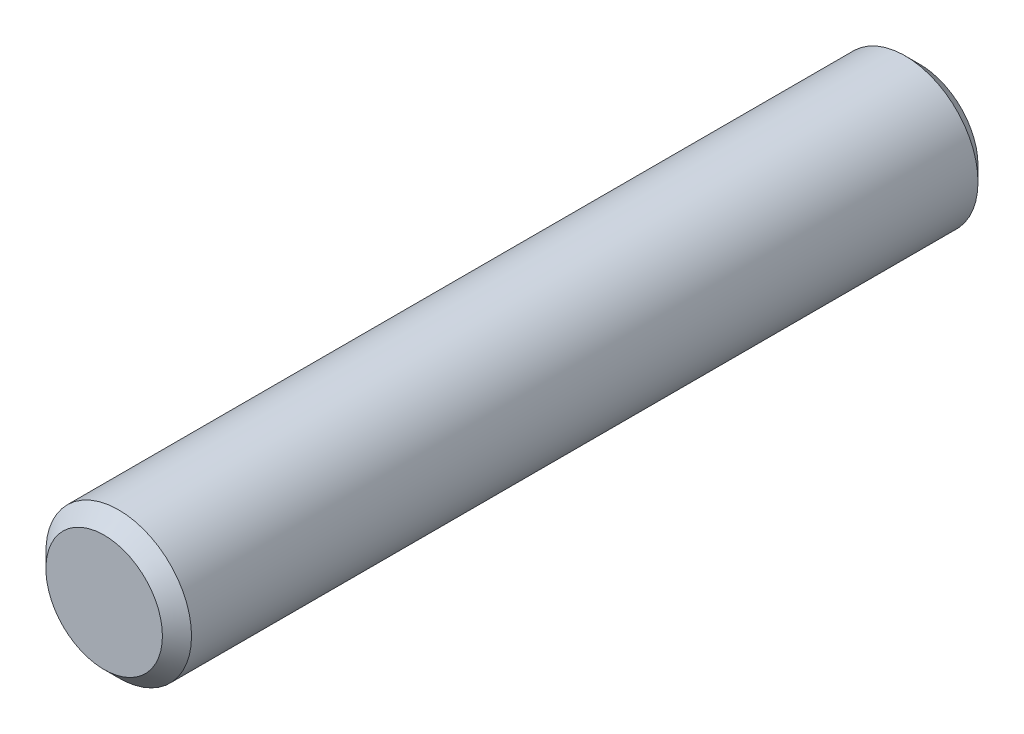
ISO-10303-21;
HEADER;
FILE_DESCRIPTION(('STEP AP214'),'2;1');
FILE_NAME('part.step','',(''),(''),'','','');
FILE_SCHEMA(('AUTOMOTIVE_DESIGN { 1 0 10303 214 1 1 1 1 }'));
ENDSEC;
DATA;
#1=APPLICATION_CONTEXT('core data for automotive mechanical design processes');
#2=APPLICATION_PROTOCOL_DEFINITION('international standard','automotive_design',2000,#1);
#3=PRODUCT_CONTEXT('',#1,'mechanical');
#4=PRODUCT('Part','Part','',(#3));
#5=PRODUCT_RELATED_PRODUCT_CATEGORY('part','',(#4));
#6=PRODUCT_DEFINITION_FORMATION('','',#4);
#7=PRODUCT_DEFINITION_CONTEXT('part definition',#1,'design');
#8=PRODUCT_DEFINITION('design','',#6,#7);
#9=PRODUCT_DEFINITION_SHAPE('','',#8);
#10=(LENGTH_UNIT() NAMED_UNIT(*) SI_UNIT(.MILLI.,.METRE.));
#11=(NAMED_UNIT(*) PLANE_ANGLE_UNIT() SI_UNIT($,.RADIAN.));
#12=(NAMED_UNIT(*) SI_UNIT($,.STERADIAN.) SOLID_ANGLE_UNIT());
#13=UNCERTAINTY_MEASURE_WITH_UNIT(LENGTH_MEASURE(1.E-05),#10,'distance_accuracy_value','');
#14=(GEOMETRIC_REPRESENTATION_CONTEXT(3) GLOBAL_UNCERTAINTY_ASSIGNED_CONTEXT((#13)) GLOBAL_UNIT_ASSIGNED_CONTEXT((#10,
#11,#12)) REPRESENTATION_CONTEXT('',''));
#15=CARTESIAN_POINT('',(0.,0.,0.));
#16=DIRECTION('',(0.,0.,1.));
#17=DIRECTION('',(1.,0.,0.));
#18=AXIS2_PLACEMENT_3D('',#15,#16,#17);
#19=CARTESIAN_POINT('',(0.,0.,28.));
#20=DIRECTION('',(0.,0.,-1.));
#21=DIRECTION('',(-1.,0.,0.));
#22=AXIS2_PLACEMENT_3D('',#19,#20,#21);
#23=CYLINDRICAL_SURFACE('',#22,2.5);
#24=CARTESIAN_POINT('',(0.,0.,0.499999999999997));
#25=DIRECTION('',(0.,0.,1.));
#26=DIRECTION('',(1.,0.,0.));
#27=AXIS2_PLACEMENT_3D('',#24,#25,#26);
#28=CIRCLE('',#27,2.5);
#29=CARTESIAN_POINT('',(2.5,0.,0.499999999999997));
#30=VERTEX_POINT('',#29);
#31=EDGE_CURVE('E53',#30,#30,#28,.T.);
#32=ORIENTED_EDGE('',*,*,#31,.T.);
#33=EDGE_LOOP('',(#32));
#34=FACE_BOUND('',#33,.T.);
#35=CARTESIAN_POINT('',(0.,0.,27.5));
#36=DIRECTION('',(0.,0.,1.));
#37=DIRECTION('',(1.,0.,0.));
#38=AXIS2_PLACEMENT_3D('',#35,#36,#37);
#39=CIRCLE('',#38,2.5);
#40=CARTESIAN_POINT('',(2.5,0.,27.5));
#41=VERTEX_POINT('',#40);
#42=EDGE_CURVE('E58',#41,#41,#39,.F.);
#43=ORIENTED_EDGE('',*,*,#42,.T.);
#44=EDGE_LOOP('',(#43));
#45=FACE_BOUND('',#44,.T.);
#46=ADVANCED_FACE('F39',(#34,#45),#23,.T.);
#47=CARTESIAN_POINT('',(0.,0.,28.));
#48=DIRECTION('',(0.,0.,1.));
#49=DIRECTION('',(1.,0.,0.));
#50=AXIS2_PLACEMENT_3D('',#47,#48,#49);
#51=PLANE('',#50);
#52=CARTESIAN_POINT('',(0.,0.,28.));
#53=DIRECTION('',(0.,0.,1.));
#54=DIRECTION('',(1.,0.,0.));
#55=AXIS2_PLACEMENT_3D('',#52,#53,#54);
#56=CIRCLE('',#55,2.);
#57=CARTESIAN_POINT('',(2.,0.,28.));
#58=VERTEX_POINT('',#57);
#59=EDGE_CURVE('E10',#58,#58,#56,.T.);
#60=ORIENTED_EDGE('',*,*,#59,.T.);
#61=EDGE_LOOP('',(#60));
#62=FACE_BOUND('',#61,.T.);
#63=ADVANCED_FACE('F75',(#62),#51,.T.);
#64=CARTESIAN_POINT('',(0.,0.,0.));
#65=DIRECTION('',(0.,0.,1.));
#66=DIRECTION('',(1.,0.,0.));
#67=AXIS2_PLACEMENT_3D('',#64,#65,#66);
#68=PLANE('',#67);
#69=CARTESIAN_POINT('',(0.,0.,0.));
#70=DIRECTION('',(0.,0.,1.));
#71=DIRECTION('',(1.,0.,0.));
#72=AXIS2_PLACEMENT_3D('',#69,#70,#71);
#73=CIRCLE('',#72,2.);
#74=CARTESIAN_POINT('',(2.,0.,0.));
#75=VERTEX_POINT('',#74);
#76=EDGE_CURVE('E48',#75,#75,#73,.F.);
#77=ORIENTED_EDGE('',*,*,#76,.T.);
#78=EDGE_LOOP('',(#77));
#79=FACE_BOUND('',#78,.T.);
#80=ADVANCED_FACE('F72',(#79),#68,.F.);
#81=CARTESIAN_POINT('',(0.,0.,0.499999999999997));
#82=DIRECTION('',(0.,0.,1.));
#83=DIRECTION('',(1.,0.,0.));
#84=AXIS2_PLACEMENT_3D('',#81,#82,#83);
#85=CONICAL_SURFACE('',#84,2.5,0.785398163397449);
#86=ORIENTED_EDGE('',*,*,#76,.F.);
#87=EDGE_LOOP('',(#86));
#88=FACE_BOUND('',#87,.T.);
#89=ORIENTED_EDGE('',*,*,#31,.F.);
#90=EDGE_LOOP('',(#89));
#91=FACE_BOUND('',#90,.T.);
#92=ADVANCED_FACE('F68',(#88,#91),#85,.T.);
#93=CARTESIAN_POINT('',(0.,0.,28.));
#94=DIRECTION('',(0.,0.,-1.));
#95=DIRECTION('',(-1.,0.,0.));
#96=AXIS2_PLACEMENT_3D('',#93,#94,#95);
#97=CONICAL_SURFACE('',#96,2.,0.785398163397446);
#98=ORIENTED_EDGE('',*,*,#42,.F.);
#99=EDGE_LOOP('',(#98));
#100=FACE_BOUND('',#99,.T.);
#101=ORIENTED_EDGE('',*,*,#59,.F.);
#102=EDGE_LOOP('',(#101));
#103=FACE_BOUND('',#102,.T.);
#104=ADVANCED_FACE('F42',(#100,#103),#97,.T.);
#105=CLOSED_SHELL('',(#46,#63,#80,#92,#104));
#106=MANIFOLD_SOLID_BREP('B2',#105);
#107=ADVANCED_BREP_SHAPE_REPRESENTATION('',(#18,#106),#14);
#108=SHAPE_DEFINITION_REPRESENTATION(#9,#107);
ENDSEC;
END-ISO-10303-21;
